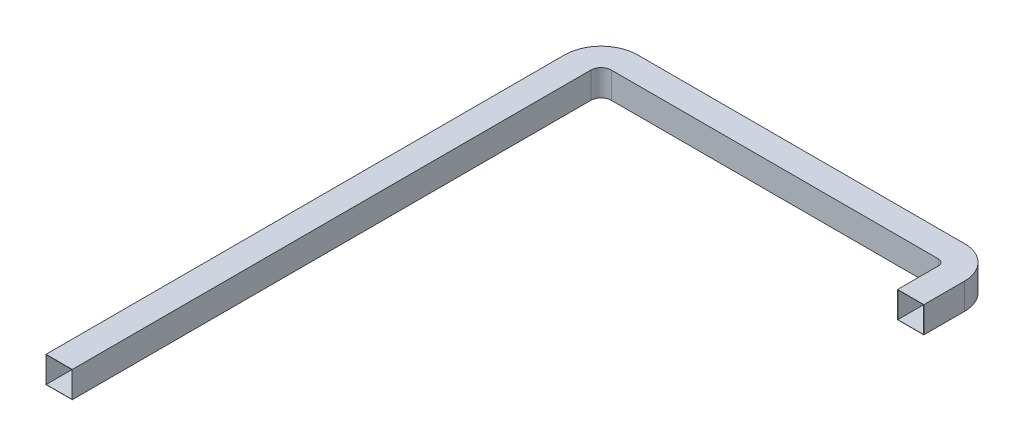
ISO-10303-21;
HEADER;
FILE_DESCRIPTION(('STEP AP214'),'2;1');
FILE_NAME('part.step','',(''),(''),'','','');
FILE_SCHEMA(('AUTOMOTIVE_DESIGN { 1 0 10303 214 1 1 1 1 }'));
ENDSEC;
DATA;
#1=APPLICATION_CONTEXT('core data for automotive mechanical design processes');
#2=APPLICATION_PROTOCOL_DEFINITION('international standard','automotive_design',2000,#1);
#3=PRODUCT_CONTEXT('',#1,'mechanical');
#4=PRODUCT('Part','Part','',(#3));
#5=PRODUCT_RELATED_PRODUCT_CATEGORY('part','',(#4));
#6=PRODUCT_DEFINITION_FORMATION('','',#4);
#7=PRODUCT_DEFINITION_CONTEXT('part definition',#1,'design');
#8=PRODUCT_DEFINITION('design','',#6,#7);
#9=PRODUCT_DEFINITION_SHAPE('','',#8);
#10=(LENGTH_UNIT() NAMED_UNIT(*) SI_UNIT(.MILLI.,.METRE.));
#11=(NAMED_UNIT(*) PLANE_ANGLE_UNIT() SI_UNIT($,.RADIAN.));
#12=(NAMED_UNIT(*) SI_UNIT($,.STERADIAN.) SOLID_ANGLE_UNIT());
#13=UNCERTAINTY_MEASURE_WITH_UNIT(LENGTH_MEASURE(1.E-05),#10,'distance_accuracy_value','');
#14=(GEOMETRIC_REPRESENTATION_CONTEXT(3) GLOBAL_UNCERTAINTY_ASSIGNED_CONTEXT((#13)) GLOBAL_UNIT_ASSIGNED_CONTEXT((#10,
#11,#12)) REPRESENTATION_CONTEXT('',''));
#15=CARTESIAN_POINT('',(0.,0.,0.));
#16=DIRECTION('',(0.,0.,1.));
#17=DIRECTION('',(1.,0.,0.));
#18=AXIS2_PLACEMENT_3D('',#15,#16,#17);
#19=CARTESIAN_POINT('',(0.,154.94,228.6));
#20=DIRECTION('',(0.,-1.,0.));
#21=DIRECTION('',(1.,0.,0.));
#22=AXIS2_PLACEMENT_3D('',#19,#20,#21);
#23=PLANE('',#22);
#24=DIRECTION('',(0.,0.,-1.));
#25=VECTOR('',#24,1.);
#26=CARTESIAN_POINT('',(154.94,154.94,228.6));
#27=LINE('',#26,#25);
#28=CARTESIAN_POINT('',(154.94,154.94,228.6));
#29=VERTEX_POINT('',#28);
#30=CARTESIAN_POINT('',(154.94,154.94,-254.));
#31=VERTEX_POINT('',#30);
#32=EDGE_CURVE('E514',#29,#31,#27,.T.);
#33=ORIENTED_EDGE('',*,*,#32,.T.);
#34=CARTESIAN_POINT('',(-226.06,154.94,-254.));
#35=DIRECTION('',(0.,1.,0.));
#36=DIRECTION('',(-1.,0.,0.));
#37=AXIS2_PLACEMENT_3D('',#34,#35,#36);
#38=CIRCLE('',#37,381.);
#39=CARTESIAN_POINT('',(-226.06,154.94,-635.));
#40=VERTEX_POINT('',#39);
#41=EDGE_CURVE('E437',#31,#40,#38,.T.);
#42=ORIENTED_EDGE('',*,*,#41,.T.);
#43=DIRECTION('',(-1.,0.,0.));
#44=VECTOR('',#43,1.);
#45=CARTESIAN_POINT('',(-226.06,154.94,-635.));
#46=LINE('',#45,#44);
#47=CARTESIAN_POINT('',(-4086.86,154.94,-634.999999999999));
#48=VERTEX_POINT('',#47);
#49=EDGE_CURVE('E460',#40,#48,#46,.T.);
#50=ORIENTED_EDGE('',*,*,#49,.T.);
#51=CARTESIAN_POINT('',(-4086.86,154.94,-203.199999999999));
#52=DIRECTION('',(0.,-1.,0.));
#53=DIRECTION('',(1.,0.,0.));
#54=AXIS2_PLACEMENT_3D('',#51,#52,#53);
#55=CIRCLE('',#54,431.8);
#56=CARTESIAN_POINT('',(-4518.66,154.94,-203.199999999999));
#57=VERTEX_POINT('',#56);
#58=EDGE_CURVE('E355',#48,#57,#55,.F.);
#59=ORIENTED_EDGE('',*,*,#58,.T.);
#60=DIRECTION('',(0.,0.,1.));
#61=VECTOR('',#60,1.);
#62=CARTESIAN_POINT('',(-4518.66,154.94,-203.199999999999));
#63=LINE('',#62,#61);
#64=CARTESIAN_POINT('',(-4518.66,154.94,5918.2));
#65=VERTEX_POINT('',#64);
#66=EDGE_CURVE('E352',#57,#65,#63,.T.);
#67=ORIENTED_EDGE('',*,*,#66,.T.);
#68=DIRECTION('',(-1.,0.,0.));
#69=VECTOR('',#68,1.);
#70=CARTESIAN_POINT('',(-4208.78,154.94,5918.2));
#71=LINE('',#70,#69);
#72=CARTESIAN_POINT('',(-4208.78,154.94,5918.2));
#73=VERTEX_POINT('',#72);
#74=EDGE_CURVE('E270',#73,#65,#71,.T.);
#75=ORIENTED_EDGE('',*,*,#74,.F.);
#76=DIRECTION('',(0.,0.,-1.));
#77=VECTOR('',#76,1.);
#78=CARTESIAN_POINT('',(-4208.78,154.94,-177.799999999999));
#79=LINE('',#78,#77);
#80=CARTESIAN_POINT('',(-4208.78,154.94,-203.199999999999));
#81=VERTEX_POINT('',#80);
#82=EDGE_CURVE('E348',#73,#81,#79,.T.);
#83=ORIENTED_EDGE('',*,*,#82,.T.);
#84=CARTESIAN_POINT('',(-4086.86,154.94,-203.199999999999));
#85=DIRECTION('',(0.,-1.,0.));
#86=DIRECTION('',(1.,0.,0.));
#87=AXIS2_PLACEMENT_3D('',#84,#85,#86);
#88=CIRCLE('',#87,121.92);
#89=CARTESIAN_POINT('',(-4086.86,154.94,-325.12));
#90=VERTEX_POINT('',#89);
#91=EDGE_CURVE('E344',#81,#90,#88,.T.);
#92=ORIENTED_EDGE('',*,*,#91,.T.);
#93=DIRECTION('',(1.,0.,0.));
#94=VECTOR('',#93,1.);
#95=CARTESIAN_POINT('',(-226.06,154.94,-325.12));
#96=LINE('',#95,#94);
#97=CARTESIAN_POINT('',(-226.06,154.94,-325.12));
#98=VERTEX_POINT('',#97);
#99=EDGE_CURVE('E463',#90,#98,#96,.T.);
#100=ORIENTED_EDGE('',*,*,#99,.T.);
#101=CARTESIAN_POINT('',(-226.06,154.94,-254.));
#102=DIRECTION('',(0.,-1.,0.));
#103=DIRECTION('',(-1.,0.,0.));
#104=AXIS2_PLACEMENT_3D('',#101,#102,#103);
#105=CIRCLE('',#104,71.1199999999999);
#106=CARTESIAN_POINT('',(-154.94,154.94,-254.));
#107=VERTEX_POINT('',#106);
#108=EDGE_CURVE('E467',#98,#107,#105,.T.);
#109=ORIENTED_EDGE('',*,*,#108,.T.);
#110=DIRECTION('',(0.,0.,-1.));
#111=VECTOR('',#110,1.);
#112=CARTESIAN_POINT('',(-154.94,154.94,228.6));
#113=LINE('',#112,#111);
#114=CARTESIAN_POINT('',(-154.94,154.94,228.6));
#115=VERTEX_POINT('',#114);
#116=EDGE_CURVE('E11',#115,#107,#113,.T.);
#117=ORIENTED_EDGE('',*,*,#116,.F.);
#118=DIRECTION('',(-1.,0.,0.));
#119=VECTOR('',#118,1.);
#120=CARTESIAN_POINT('',(0.,154.94,228.6));
#121=LINE('',#120,#119);
#122=EDGE_CURVE('E503',#29,#115,#121,.T.);
#123=ORIENTED_EDGE('',*,*,#122,.F.);
#124=EDGE_LOOP('',(#33,#42,#50,#59,#67,#75,#83,#92,#100,#109,#117,#123));
#125=FACE_BOUND('',#124,.T.);
#126=ADVANCED_FACE('F43',(#125),#23,.F.);
#127=CARTESIAN_POINT('',(-154.94,0.,228.6));
#128=DIRECTION('',(1.,0.,0.));
#129=DIRECTION('',(0.,1.,0.));
#130=AXIS2_PLACEMENT_3D('',#127,#128,#129);
#131=PLANE('',#130);
#132=ORIENTED_EDGE('',*,*,#116,.T.);
#133=DIRECTION('',(0.,1.,0.));
#134=VECTOR('',#133,1.);
#135=CARTESIAN_POINT('',(-154.94,-729.676391748426,-254.));
#136=LINE('',#135,#134);
#137=CARTESIAN_POINT('',(-154.94,-154.94,-254.));
#138=VERTEX_POINT('',#137);
#139=EDGE_CURVE('E450',#138,#107,#136,.T.);
#140=ORIENTED_EDGE('',*,*,#139,.F.);
#141=DIRECTION('',(0.,0.,-1.));
#142=VECTOR('',#141,1.);
#143=CARTESIAN_POINT('',(-154.94,-154.94,228.6));
#144=LINE('',#143,#142);
#145=CARTESIAN_POINT('',(-154.94,-154.94,228.6));
#146=VERTEX_POINT('',#145);
#147=EDGE_CURVE('E53',#146,#138,#144,.T.);
#148=ORIENTED_EDGE('',*,*,#147,.F.);
#149=DIRECTION('',(0.,-1.,0.));
#150=VECTOR('',#149,1.);
#151=CARTESIAN_POINT('',(-154.94,0.,228.6));
#152=LINE('',#151,#150);
#153=EDGE_CURVE('E506',#115,#146,#152,.T.);
#154=ORIENTED_EDGE('',*,*,#153,.F.);
#155=EDGE_LOOP('',(#132,#140,#148,#154));
#156=FACE_BOUND('',#155,.T.);
#157=ADVANCED_FACE('F575',(#156),#131,.F.);
#158=CARTESIAN_POINT('',(0.,-154.94,228.6));
#159=DIRECTION('',(0.,1.,0.));
#160=DIRECTION('',(0.,0.,1.));
#161=AXIS2_PLACEMENT_3D('',#158,#159,#160);
#162=PLANE('',#161);
#163=ORIENTED_EDGE('',*,*,#147,.T.);
#164=CARTESIAN_POINT('',(-226.06,-154.94,-254.));
#165=DIRECTION('',(0.,1.,0.));
#166=DIRECTION('',(0.,0.,1.));
#167=AXIS2_PLACEMENT_3D('',#164,#165,#166);
#168=CIRCLE('',#167,71.1199999999999);
#169=CARTESIAN_POINT('',(-226.06,-154.94,-325.12));
#170=VERTEX_POINT('',#169);
#171=EDGE_CURVE('E453',#138,#170,#168,.T.);
#172=ORIENTED_EDGE('',*,*,#171,.T.);
#173=DIRECTION('',(-1.,0.,0.));
#174=VECTOR('',#173,1.);
#175=CARTESIAN_POINT('',(-226.06,-154.94,-325.12));
#176=LINE('',#175,#174);
#177=CARTESIAN_POINT('',(-4086.86,-154.94,-325.12));
#178=VERTEX_POINT('',#177);
#179=EDGE_CURVE('E449',#170,#178,#176,.T.);
#180=ORIENTED_EDGE('',*,*,#179,.T.);
#181=CARTESIAN_POINT('',(-4086.86,-154.94,-203.199999999999));
#182=DIRECTION('',(0.,1.,0.));
#183=DIRECTION('',(0.,0.,-1.));
#184=AXIS2_PLACEMENT_3D('',#181,#182,#183);
#185=CIRCLE('',#184,121.92);
#186=CARTESIAN_POINT('',(-4208.78,-154.94,-203.199999999999));
#187=VERTEX_POINT('',#186);
#188=EDGE_CURVE('E343',#178,#187,#185,.T.);
#189=ORIENTED_EDGE('',*,*,#188,.T.);
#190=DIRECTION('',(0.,0.,1.));
#191=VECTOR('',#190,1.);
#192=CARTESIAN_POINT('',(-4208.78,-154.94,-177.799999999999));
#193=LINE('',#192,#191);
#194=CARTESIAN_POINT('',(-4208.78,-154.94,5918.2));
#195=VERTEX_POINT('',#194);
#196=EDGE_CURVE('E362',#187,#195,#193,.T.);
#197=ORIENTED_EDGE('',*,*,#196,.T.);
#198=DIRECTION('',(1.,0.,0.));
#199=VECTOR('',#198,1.);
#200=CARTESIAN_POINT('',(-4518.66,-154.94,5918.2));
#201=LINE('',#200,#199);
#202=CARTESIAN_POINT('',(-4518.66,-154.94,5918.2));
#203=VERTEX_POINT('',#202);
#204=EDGE_CURVE('E278',#203,#195,#201,.T.);
#205=ORIENTED_EDGE('',*,*,#204,.F.);
#206=DIRECTION('',(0.,0.,-1.));
#207=VECTOR('',#206,1.);
#208=CARTESIAN_POINT('',(-4518.66,-154.94,-203.199999999999));
#209=LINE('',#208,#207);
#210=CARTESIAN_POINT('',(-4518.66,-154.94,-203.199999999999));
#211=VERTEX_POINT('',#210);
#212=EDGE_CURVE('E365',#203,#211,#209,.T.);
#213=ORIENTED_EDGE('',*,*,#212,.T.);
#214=CARTESIAN_POINT('',(-4086.86,-154.94,-203.199999999999));
#215=DIRECTION('',(0.,-1.,0.));
#216=DIRECTION('',(0.,0.,1.));
#217=AXIS2_PLACEMENT_3D('',#214,#215,#216);
#218=CIRCLE('',#217,431.8);
#219=CARTESIAN_POINT('',(-4086.86,-154.94,-634.999999999999));
#220=VERTEX_POINT('',#219);
#221=EDGE_CURVE('E369',#211,#220,#218,.T.);
#222=ORIENTED_EDGE('',*,*,#221,.T.);
#223=DIRECTION('',(1.,0.,0.));
#224=VECTOR('',#223,1.);
#225=CARTESIAN_POINT('',(-226.06,-154.94,-635.));
#226=LINE('',#225,#224);
#227=CARTESIAN_POINT('',(-226.06,-154.94,-635.));
#228=VERTEX_POINT('',#227);
#229=EDGE_CURVE('E446',#220,#228,#226,.T.);
#230=ORIENTED_EDGE('',*,*,#229,.T.);
#231=CARTESIAN_POINT('',(-226.06,-154.94,-254.));
#232=DIRECTION('',(0.,1.,0.));
#233=DIRECTION('',(0.,0.,1.));
#234=AXIS2_PLACEMENT_3D('',#231,#232,#233);
#235=CIRCLE('',#234,381.);
#236=CARTESIAN_POINT('',(154.94,-154.94,-254.));
#237=VERTEX_POINT('',#236);
#238=EDGE_CURVE('E456',#228,#237,#235,.F.);
#239=ORIENTED_EDGE('',*,*,#238,.T.);
#240=DIRECTION('',(0.,0.,-1.));
#241=VECTOR('',#240,1.);
#242=CARTESIAN_POINT('',(154.94,-154.94,228.6));
#243=LINE('',#242,#241);
#244=CARTESIAN_POINT('',(154.94,-154.94,228.6));
#245=VERTEX_POINT('',#244);
#246=EDGE_CURVE('E517',#245,#237,#243,.T.);
#247=ORIENTED_EDGE('',*,*,#246,.F.);
#248=DIRECTION('',(1.,0.,0.));
#249=VECTOR('',#248,1.);
#250=CARTESIAN_POINT('',(0.,-154.94,228.6));
#251=LINE('',#250,#249);
#252=EDGE_CURVE('E66',#146,#245,#251,.T.);
#253=ORIENTED_EDGE('',*,*,#252,.F.);
#254=EDGE_LOOP('',(#163,#172,#180,#189,#197,#205,#213,#222,#230,#239,#247,#253));
#255=FACE_BOUND('',#254,.T.);
#256=ADVANCED_FACE('F581',(#255),#162,.F.);
#257=CARTESIAN_POINT('',(-152.4,0.,228.6));
#258=DIRECTION('',(1.,0.,0.));
#259=DIRECTION('',(0.,0.,-1.));
#260=AXIS2_PLACEMENT_3D('',#257,#258,#259);
#261=PLANE('',#260);
#262=DIRECTION('',(0.,0.,-1.));
#263=VECTOR('',#262,1.);
#264=CARTESIAN_POINT('',(-152.4,-152.4,228.6));
#265=LINE('',#264,#263);
#266=CARTESIAN_POINT('',(-152.4,-152.4,228.6));
#267=VERTEX_POINT('',#266);
#268=CARTESIAN_POINT('',(-152.4,-152.4,-254.));
#269=VERTEX_POINT('',#268);
#270=EDGE_CURVE('E513',#267,#269,#265,.T.);
#271=ORIENTED_EDGE('',*,*,#270,.T.);
#272=DIRECTION('',(0.,1.,0.));
#273=VECTOR('',#272,1.);
#274=CARTESIAN_POINT('',(-152.4,-729.676391748426,-254.));
#275=LINE('',#274,#273);
#276=CARTESIAN_POINT('',(-152.4,152.4,-254.));
#277=VERTEX_POINT('',#276);
#278=EDGE_CURVE('E418',#269,#277,#275,.T.);
#279=ORIENTED_EDGE('',*,*,#278,.T.);
#280=DIRECTION('',(0.,0.,-1.));
#281=VECTOR('',#280,1.);
#282=CARTESIAN_POINT('',(-152.4,152.4,228.6));
#283=LINE('',#282,#281);
#284=CARTESIAN_POINT('',(-152.4,152.4,228.6));
#285=VERTEX_POINT('',#284);
#286=EDGE_CURVE('E47',#285,#277,#283,.T.);
#287=ORIENTED_EDGE('',*,*,#286,.F.);
#288=DIRECTION('',(0.,-1.,0.));
#289=VECTOR('',#288,1.);
#290=CARTESIAN_POINT('',(-152.4,0.,228.6));
#291=LINE('',#290,#289);
#292=EDGE_CURVE('E487',#285,#267,#291,.T.);
#293=ORIENTED_EDGE('',*,*,#292,.T.);
#294=EDGE_LOOP('',(#271,#279,#287,#293));
#295=FACE_BOUND('',#294,.T.);
#296=ADVANCED_FACE('F45',(#295),#261,.T.);
#297=CARTESIAN_POINT('',(0.,152.4,228.6));
#298=DIRECTION('',(0.,-1.,0.));
#299=DIRECTION('',(0.,0.,-1.));
#300=AXIS2_PLACEMENT_3D('',#297,#298,#299);
#301=PLANE('',#300);
#302=ORIENTED_EDGE('',*,*,#286,.T.);
#303=CARTESIAN_POINT('',(-226.06,152.4,-254.));
#304=DIRECTION('',(0.,-1.,0.));
#305=DIRECTION('',(1.,0.,0.));
#306=AXIS2_PLACEMENT_3D('',#303,#304,#305);
#307=CIRCLE('',#306,73.6599999999999);
#308=CARTESIAN_POINT('',(-226.06,152.4,-327.66));
#309=VERTEX_POINT('',#308);
#310=EDGE_CURVE('E413',#309,#277,#307,.T.);
#311=ORIENTED_EDGE('',*,*,#310,.F.);
#312=DIRECTION('',(1.,0.,0.));
#313=VECTOR('',#312,1.);
#314=CARTESIAN_POINT('',(-226.06,152.4,-327.66));
#315=LINE('',#314,#313);
#316=CARTESIAN_POINT('',(-4061.46,152.4,-327.659999999999));
#317=VERTEX_POINT('',#316);
#318=EDGE_CURVE('E409',#317,#309,#315,.T.);
#319=ORIENTED_EDGE('',*,*,#318,.F.);
#320=DIRECTION('',(0.,0.,-1.));
#321=VECTOR('',#320,1.);
#322=CARTESIAN_POINT('',(-4061.46,152.4,-632.459999999999));
#323=LINE('',#322,#321);
#324=CARTESIAN_POINT('',(-4061.46,152.4,-632.459999999999));
#325=VERTEX_POINT('',#324);
#326=EDGE_CURVE('E389',#317,#325,#323,.T.);
#327=ORIENTED_EDGE('',*,*,#326,.T.);
#328=DIRECTION('',(-1.,0.,0.));
#329=VECTOR('',#328,1.);
#330=CARTESIAN_POINT('',(-226.06,152.4,-632.46));
#331=LINE('',#330,#329);
#332=CARTESIAN_POINT('',(-226.06,152.4,-632.46));
#333=VERTEX_POINT('',#332);
#334=EDGE_CURVE('E405',#333,#325,#331,.T.);
#335=ORIENTED_EDGE('',*,*,#334,.F.);
#336=CARTESIAN_POINT('',(-226.06,152.4,-254.));
#337=DIRECTION('',(0.,-1.,0.));
#338=DIRECTION('',(1.,0.,0.));
#339=AXIS2_PLACEMENT_3D('',#336,#337,#338);
#340=CIRCLE('',#339,378.46);
#341=CARTESIAN_POINT('',(152.4,152.4,-254.));
#342=VERTEX_POINT('',#341);
#343=EDGE_CURVE('E401',#342,#333,#340,.F.);
#344=ORIENTED_EDGE('',*,*,#343,.F.);
#345=DIRECTION('',(0.,0.,-1.));
#346=VECTOR('',#345,1.);
#347=CARTESIAN_POINT('',(152.4,152.4,228.6));
#348=LINE('',#347,#346);
#349=CARTESIAN_POINT('',(152.4,152.4,228.6));
#350=VERTEX_POINT('',#349);
#351=EDGE_CURVE('E526',#350,#342,#348,.T.);
#352=ORIENTED_EDGE('',*,*,#351,.F.);
#353=DIRECTION('',(-1.,0.,0.));
#354=VECTOR('',#353,1.);
#355=CARTESIAN_POINT('',(0.,152.4,228.6));
#356=LINE('',#355,#354);
#357=EDGE_CURVE('E491',#350,#285,#356,.T.);
#358=ORIENTED_EDGE('',*,*,#357,.T.);
#359=EDGE_LOOP('',(#302,#311,#319,#327,#335,#344,#352,#358));
#360=FACE_BOUND('',#359,.T.);
#361=ADVANCED_FACE('F533',(#360),#301,.T.);
#362=CARTESIAN_POINT('',(152.4,0.,228.6));
#363=DIRECTION('',(-1.,0.,0.));
#364=DIRECTION('',(0.,0.,1.));
#365=AXIS2_PLACEMENT_3D('',#362,#363,#364);
#366=PLANE('',#365);
#367=ORIENTED_EDGE('',*,*,#351,.T.);
#368=DIRECTION('',(0.,1.,0.));
#369=VECTOR('',#368,1.);
#370=CARTESIAN_POINT('',(152.4,0.,-254.));
#371=LINE('',#370,#369);
#372=CARTESIAN_POINT('',(152.4,-152.4,-254.));
#373=VERTEX_POINT('',#372);
#374=EDGE_CURVE('E417',#373,#342,#371,.T.);
#375=ORIENTED_EDGE('',*,*,#374,.F.);
#376=DIRECTION('',(0.,0.,-1.));
#377=VECTOR('',#376,1.);
#378=CARTESIAN_POINT('',(152.4,-152.4,228.6));
#379=LINE('',#378,#377);
#380=CARTESIAN_POINT('',(152.4,-152.4,228.6));
#381=VERTEX_POINT('',#380);
#382=EDGE_CURVE('E524',#381,#373,#379,.T.);
#383=ORIENTED_EDGE('',*,*,#382,.F.);
#384=DIRECTION('',(0.,1.,0.));
#385=VECTOR('',#384,1.);
#386=CARTESIAN_POINT('',(152.4,0.,228.6));
#387=LINE('',#386,#385);
#388=EDGE_CURVE('E495',#381,#350,#387,.T.);
#389=ORIENTED_EDGE('',*,*,#388,.T.);
#390=EDGE_LOOP('',(#367,#375,#383,#389));
#391=FACE_BOUND('',#390,.T.);
#392=ADVANCED_FACE('F561',(#391),#366,.T.);
#393=CARTESIAN_POINT('',(0.,-152.4,228.6));
#394=DIRECTION('',(0.,1.,0.));
#395=DIRECTION('',(0.,0.,1.));
#396=AXIS2_PLACEMENT_3D('',#393,#394,#395);
#397=PLANE('',#396);
#398=ORIENTED_EDGE('',*,*,#382,.T.);
#399=CARTESIAN_POINT('',(-226.06,-152.4,-254.));
#400=DIRECTION('',(0.,1.,0.));
#401=DIRECTION('',(0.,0.,1.));
#402=AXIS2_PLACEMENT_3D('',#399,#400,#401);
#403=CIRCLE('',#402,378.46);
#404=CARTESIAN_POINT('',(-226.06,-152.4,-632.46));
#405=VERTEX_POINT('',#404);
#406=EDGE_CURVE('E427',#405,#373,#403,.F.);
#407=ORIENTED_EDGE('',*,*,#406,.F.);
#408=DIRECTION('',(1.,0.,0.));
#409=VECTOR('',#408,1.);
#410=CARTESIAN_POINT('',(-226.06,-152.4,-632.46));
#411=LINE('',#410,#409);
#412=CARTESIAN_POINT('',(-4061.46,-152.4,-632.46));
#413=VERTEX_POINT('',#412);
#414=EDGE_CURVE('E422',#413,#405,#411,.T.);
#415=ORIENTED_EDGE('',*,*,#414,.F.);
#416=DIRECTION('',(0.,0.,1.));
#417=VECTOR('',#416,1.);
#418=CARTESIAN_POINT('',(-4061.46,-152.4,-327.659999999999));
#419=LINE('',#418,#417);
#420=CARTESIAN_POINT('',(-4061.46,-152.4,-327.659999999999));
#421=VERTEX_POINT('',#420);
#422=EDGE_CURVE('E397',#413,#421,#419,.T.);
#423=ORIENTED_EDGE('',*,*,#422,.T.);
#424=DIRECTION('',(-1.,0.,0.));
#425=VECTOR('',#424,1.);
#426=CARTESIAN_POINT('',(-226.06,-152.4,-327.66));
#427=LINE('',#426,#425);
#428=CARTESIAN_POINT('',(-226.06,-152.4,-327.66));
#429=VERTEX_POINT('',#428);
#430=EDGE_CURVE('E428',#429,#421,#427,.T.);
#431=ORIENTED_EDGE('',*,*,#430,.F.);
#432=CARTESIAN_POINT('',(-226.06,-152.4,-254.));
#433=DIRECTION('',(0.,1.,0.));
#434=DIRECTION('',(0.,0.,1.));
#435=AXIS2_PLACEMENT_3D('',#432,#433,#434);
#436=CIRCLE('',#435,73.6599999999999);
#437=EDGE_CURVE('E424',#269,#429,#436,.T.);
#438=ORIENTED_EDGE('',*,*,#437,.F.);
#439=ORIENTED_EDGE('',*,*,#270,.F.);
#440=DIRECTION('',(1.,0.,0.));
#441=VECTOR('',#440,1.);
#442=CARTESIAN_POINT('',(0.,-152.4,228.6));
#443=LINE('',#442,#441);
#444=EDGE_CURVE('E499',#267,#381,#443,.T.);
#445=ORIENTED_EDGE('',*,*,#444,.T.);
#446=EDGE_LOOP('',(#398,#407,#415,#423,#431,#438,#439,#445));
#447=FACE_BOUND('',#446,.T.);
#448=ADVANCED_FACE('F558',(#447),#397,.T.);
#449=CARTESIAN_POINT('',(154.94,0.,228.6));
#450=DIRECTION('',(-1.,0.,0.));
#451=DIRECTION('',(0.,0.,1.));
#452=AXIS2_PLACEMENT_3D('',#449,#450,#451);
#453=PLANE('',#452);
#454=ORIENTED_EDGE('',*,*,#246,.T.);
#455=DIRECTION('',(0.,1.,0.));
#456=VECTOR('',#455,1.);
#457=CARTESIAN_POINT('',(154.94,-729.676391748426,-254.));
#458=LINE('',#457,#456);
#459=EDGE_CURVE('E471',#237,#31,#458,.T.);
#460=ORIENTED_EDGE('',*,*,#459,.T.);
#461=ORIENTED_EDGE('',*,*,#32,.F.);
#462=DIRECTION('',(0.,1.,0.));
#463=VECTOR('',#462,1.);
#464=CARTESIAN_POINT('',(154.94,0.,228.6));
#465=LINE('',#464,#463);
#466=EDGE_CURVE('E61',#245,#29,#465,.T.);
#467=ORIENTED_EDGE('',*,*,#466,.F.);
#468=EDGE_LOOP('',(#454,#460,#461,#467));
#469=FACE_BOUND('',#468,.T.);
#470=ADVANCED_FACE('F566',(#469),#453,.F.);
#471=CARTESIAN_POINT('',(0.,0.,228.6));
#472=DIRECTION('',(0.,0.,1.));
#473=DIRECTION('',(1.,0.,0.));
#474=AXIS2_PLACEMENT_3D('',#471,#472,#473);
#475=PLANE('',#474);
#476=ORIENTED_EDGE('',*,*,#292,.F.);
#477=ORIENTED_EDGE('',*,*,#357,.F.);
#478=ORIENTED_EDGE('',*,*,#388,.F.);
#479=ORIENTED_EDGE('',*,*,#444,.F.);
#480=EDGE_LOOP('',(#476,#477,#478,#479));
#481=FACE_BOUND('',#480,.T.);
#482=ORIENTED_EDGE('',*,*,#122,.T.);
#483=ORIENTED_EDGE('',*,*,#153,.T.);
#484=ORIENTED_EDGE('',*,*,#252,.T.);
#485=ORIENTED_EDGE('',*,*,#466,.T.);
#486=EDGE_LOOP('',(#482,#483,#484,#485));
#487=FACE_BOUND('',#486,.T.);
#488=ADVANCED_FACE('F563',(#481,#487),#475,.T.);
#489=CARTESIAN_POINT('',(-226.06,-729.676391748426,-254.));
#490=DIRECTION('',(0.,1.,0.));
#491=DIRECTION('',(-1.,0.,0.));
#492=AXIS2_PLACEMENT_3D('',#489,#490,#491);
#493=CYLINDRICAL_SURFACE('',#492,71.1199999999999);
#494=ORIENTED_EDGE('',*,*,#171,.F.);
#495=ORIENTED_EDGE('',*,*,#139,.T.);
#496=ORIENTED_EDGE('',*,*,#108,.F.);
#497=DIRECTION('',(0.,1.,0.));
#498=VECTOR('',#497,1.);
#499=CARTESIAN_POINT('',(-226.06,-729.676391748426,-325.12));
#500=LINE('',#499,#498);
#501=EDGE_CURVE('E475',#170,#98,#500,.T.);
#502=ORIENTED_EDGE('',*,*,#501,.F.);
#503=EDGE_LOOP('',(#494,#495,#496,#502));
#504=FACE_BOUND('',#503,.T.);
#505=ADVANCED_FACE('F565',(#504),#493,.F.);
#506=CARTESIAN_POINT('',(-226.06,-729.676391748426,-325.12));
#507=DIRECTION('',(0.,0.,1.));
#508=DIRECTION('',(1.,0.,0.));
#509=AXIS2_PLACEMENT_3D('',#506,#507,#508);
#510=PLANE('',#509);
#511=ORIENTED_EDGE('',*,*,#179,.F.);
#512=ORIENTED_EDGE('',*,*,#501,.T.);
#513=ORIENTED_EDGE('',*,*,#99,.F.);
#514=DIRECTION('',(0.,-1.,0.));
#515=VECTOR('',#514,1.);
#516=CARTESIAN_POINT('',(-4086.86,801.518440716979,-325.12));
#517=LINE('',#516,#515);
#518=EDGE_CURVE('E373',#90,#178,#517,.T.);
#519=ORIENTED_EDGE('',*,*,#518,.T.);
#520=EDGE_LOOP('',(#511,#512,#513,#519));
#521=FACE_BOUND('',#520,.T.);
#522=ADVANCED_FACE('F583',(#521),#510,.T.);
#523=CARTESIAN_POINT('',(-226.06,-729.676391748426,-635.));
#524=DIRECTION('',(0.,0.,-1.));
#525=DIRECTION('',(-1.,0.,0.));
#526=AXIS2_PLACEMENT_3D('',#523,#524,#525);
#527=PLANE('',#526);
#528=ORIENTED_EDGE('',*,*,#229,.F.);
#529=DIRECTION('',(0.,-1.,0.));
#530=VECTOR('',#529,1.);
#531=CARTESIAN_POINT('',(-4086.86,801.518440716979,-634.999999999999));
#532=LINE('',#531,#530);
#533=EDGE_CURVE('E349',#48,#220,#532,.T.);
#534=ORIENTED_EDGE('',*,*,#533,.F.);
#535=ORIENTED_EDGE('',*,*,#49,.F.);
#536=DIRECTION('',(0.,1.,0.));
#537=VECTOR('',#536,1.);
#538=CARTESIAN_POINT('',(-226.06,-729.676391748426,-635.));
#539=LINE('',#538,#537);
#540=EDGE_CURVE('E478',#228,#40,#539,.T.);
#541=ORIENTED_EDGE('',*,*,#540,.F.);
#542=EDGE_LOOP('',(#528,#534,#535,#541));
#543=FACE_BOUND('',#542,.T.);
#544=ADVANCED_FACE('F610',(#543),#527,.T.);
#545=CARTESIAN_POINT('',(-226.06,-729.676391748426,-254.));
#546=DIRECTION('',(0.,1.,0.));
#547=DIRECTION('',(-1.,0.,0.));
#548=AXIS2_PLACEMENT_3D('',#545,#546,#547);
#549=CYLINDRICAL_SURFACE('',#548,381.);
#550=ORIENTED_EDGE('',*,*,#238,.F.);
#551=ORIENTED_EDGE('',*,*,#540,.T.);
#552=ORIENTED_EDGE('',*,*,#41,.F.);
#553=ORIENTED_EDGE('',*,*,#459,.F.);
#554=EDGE_LOOP('',(#550,#551,#552,#553));
#555=FACE_BOUND('',#554,.T.);
#556=ADVANCED_FACE('F615',(#555),#549,.T.);
#557=CARTESIAN_POINT('',(-226.06,-729.676391748426,-254.));
#558=DIRECTION('',(0.,1.,0.));
#559=DIRECTION('',(-1.,0.,0.));
#560=AXIS2_PLACEMENT_3D('',#557,#558,#559);
#561=CYLINDRICAL_SURFACE('',#560,73.6599999999999);
#562=ORIENTED_EDGE('',*,*,#437,.T.);
#563=DIRECTION('',(0.,1.,0.));
#564=VECTOR('',#563,1.);
#565=CARTESIAN_POINT('',(-226.06,-729.676391748426,-327.66));
#566=LINE('',#565,#564);
#567=EDGE_CURVE('E423',#429,#309,#566,.T.);
#568=ORIENTED_EDGE('',*,*,#567,.T.);
#569=ORIENTED_EDGE('',*,*,#310,.T.);
#570=ORIENTED_EDGE('',*,*,#278,.F.);
#571=EDGE_LOOP('',(#562,#568,#569,#570));
#572=FACE_BOUND('',#571,.T.);
#573=ADVANCED_FACE('F541',(#572),#561,.T.);
#574=CARTESIAN_POINT('',(-226.06,-729.676391748426,-327.66));
#575=DIRECTION('',(0.,0.,1.));
#576=DIRECTION('',(1.,0.,0.));
#577=AXIS2_PLACEMENT_3D('',#574,#575,#576);
#578=PLANE('',#577);
#579=ORIENTED_EDGE('',*,*,#430,.T.);
#580=DIRECTION('',(0.,1.,0.));
#581=VECTOR('',#580,1.);
#582=CARTESIAN_POINT('',(-4061.46,-152.4,-327.659999999999));
#583=LINE('',#582,#581);
#584=EDGE_CURVE('E358',#421,#317,#583,.T.);
#585=ORIENTED_EDGE('',*,*,#584,.T.);
#586=ORIENTED_EDGE('',*,*,#318,.T.);
#587=ORIENTED_EDGE('',*,*,#567,.F.);
#588=EDGE_LOOP('',(#579,#585,#586,#587));
#589=FACE_BOUND('',#588,.T.);
#590=ADVANCED_FACE('F545',(#589),#578,.F.);
#591=CARTESIAN_POINT('',(-226.06,-729.676391748426,-632.46));
#592=DIRECTION('',(0.,0.,-1.));
#593=DIRECTION('',(-1.,0.,0.));
#594=AXIS2_PLACEMENT_3D('',#591,#592,#593);
#595=PLANE('',#594);
#596=ORIENTED_EDGE('',*,*,#414,.T.);
#597=DIRECTION('',(0.,1.,0.));
#598=VECTOR('',#597,1.);
#599=CARTESIAN_POINT('',(-226.06,-729.676391748426,-632.46));
#600=LINE('',#599,#598);
#601=EDGE_CURVE('E441',#405,#333,#600,.T.);
#602=ORIENTED_EDGE('',*,*,#601,.T.);
#603=ORIENTED_EDGE('',*,*,#334,.T.);
#604=DIRECTION('',(0.,-1.,0.));
#605=VECTOR('',#604,1.);
#606=CARTESIAN_POINT('',(-4061.46,-152.4,-632.459999999999));
#607=LINE('',#606,#605);
#608=EDGE_CURVE('E393',#325,#413,#607,.T.);
#609=ORIENTED_EDGE('',*,*,#608,.T.);
#610=EDGE_LOOP('',(#596,#602,#603,#609));
#611=FACE_BOUND('',#610,.T.);
#612=ADVANCED_FACE('F552',(#611),#595,.F.);
#613=CARTESIAN_POINT('',(-226.06,-729.676391748426,-254.));
#614=DIRECTION('',(0.,1.,0.));
#615=DIRECTION('',(-1.,0.,0.));
#616=AXIS2_PLACEMENT_3D('',#613,#614,#615);
#617=CYLINDRICAL_SURFACE('',#616,378.46);
#618=ORIENTED_EDGE('',*,*,#406,.T.);
#619=ORIENTED_EDGE('',*,*,#374,.T.);
#620=ORIENTED_EDGE('',*,*,#343,.T.);
#621=ORIENTED_EDGE('',*,*,#601,.F.);
#622=EDGE_LOOP('',(#618,#619,#620,#621));
#623=FACE_BOUND('',#622,.T.);
#624=ADVANCED_FACE('F556',(#623),#617,.F.);
#625=CARTESIAN_POINT('',(-4061.46,801.518440716979,-325.119999999999));
#626=DIRECTION('',(1.,0.,0.));
#627=DIRECTION('',(0.,0.,-1.));
#628=AXIS2_PLACEMENT_3D('',#625,#626,#627);
#629=PLANE('',#628);
#630=ORIENTED_EDGE('',*,*,#326,.F.);
#631=ORIENTED_EDGE('',*,*,#584,.F.);
#632=ORIENTED_EDGE('',*,*,#422,.F.);
#633=ORIENTED_EDGE('',*,*,#608,.F.);
#634=EDGE_LOOP('',(#630,#631,#632,#633));
#635=FACE_BOUND('',#634,.T.);
#636=ADVANCED_FACE('F549',(#635),#629,.T.);
#637=CARTESIAN_POINT('',(-4086.86,801.518440716979,-203.199999999999));
#638=DIRECTION('',(0.,-1.,0.));
#639=DIRECTION('',(0.,0.,-1.));
#640=AXIS2_PLACEMENT_3D('',#637,#638,#639);
#641=CYLINDRICAL_SURFACE('',#640,431.8);
#642=ORIENTED_EDGE('',*,*,#58,.F.);
#643=ORIENTED_EDGE('',*,*,#533,.T.);
#644=ORIENTED_EDGE('',*,*,#221,.F.);
#645=DIRECTION('',(0.,-1.,0.));
#646=VECTOR('',#645,1.);
#647=CARTESIAN_POINT('',(-4518.66,801.518440716979,-203.199999999999));
#648=LINE('',#647,#646);
#649=EDGE_CURVE('E377',#57,#211,#648,.T.);
#650=ORIENTED_EDGE('',*,*,#649,.F.);
#651=EDGE_LOOP('',(#642,#643,#644,#650));
#652=FACE_BOUND('',#651,.T.);
#653=ADVANCED_FACE('F606',(#652),#641,.T.);
#654=CARTESIAN_POINT('',(-4518.66,801.518440716979,-203.199999999999));
#655=DIRECTION('',(-1.,0.,0.));
#656=DIRECTION('',(0.,0.,1.));
#657=AXIS2_PLACEMENT_3D('',#654,#655,#656);
#658=PLANE('',#657);
#659=ORIENTED_EDGE('',*,*,#66,.F.);
#660=ORIENTED_EDGE('',*,*,#649,.T.);
#661=ORIENTED_EDGE('',*,*,#212,.F.);
#662=DIRECTION('',(0.,-1.,0.));
#663=VECTOR('',#662,1.);
#664=CARTESIAN_POINT('',(-4518.66,154.94,5918.2));
#665=LINE('',#664,#663);
#666=EDGE_CURVE('E274',#65,#203,#665,.T.);
#667=ORIENTED_EDGE('',*,*,#666,.F.);
#668=EDGE_LOOP('',(#659,#660,#661,#667));
#669=FACE_BOUND('',#668,.T.);
#670=ADVANCED_FACE('F600',(#669),#658,.T.);
#671=CARTESIAN_POINT('',(-4208.78,801.518440716979,-177.799999999999));
#672=DIRECTION('',(1.,0.,0.));
#673=DIRECTION('',(0.,0.,-1.));
#674=AXIS2_PLACEMENT_3D('',#671,#672,#673);
#675=PLANE('',#674);
#676=ORIENTED_EDGE('',*,*,#82,.F.);
#677=DIRECTION('',(0.,1.,0.));
#678=VECTOR('',#677,1.);
#679=CARTESIAN_POINT('',(-4208.78,-154.94,5918.2));
#680=LINE('',#679,#678);
#681=EDGE_CURVE('E266',#195,#73,#680,.T.);
#682=ORIENTED_EDGE('',*,*,#681,.F.);
#683=ORIENTED_EDGE('',*,*,#196,.F.);
#684=DIRECTION('',(0.,-1.,0.));
#685=VECTOR('',#684,1.);
#686=CARTESIAN_POINT('',(-4208.78,801.518440716979,-203.199999999999));
#687=LINE('',#686,#685);
#688=EDGE_CURVE('E380',#81,#187,#687,.T.);
#689=ORIENTED_EDGE('',*,*,#688,.F.);
#690=EDGE_LOOP('',(#676,#682,#683,#689));
#691=FACE_BOUND('',#690,.T.);
#692=ADVANCED_FACE('F596',(#691),#675,.T.);
#693=CARTESIAN_POINT('',(-4086.86,801.518440716979,-203.199999999999));
#694=DIRECTION('',(0.,-1.,0.));
#695=DIRECTION('',(0.,0.,-1.));
#696=AXIS2_PLACEMENT_3D('',#693,#694,#695);
#697=CYLINDRICAL_SURFACE('',#696,121.92);
#698=ORIENTED_EDGE('',*,*,#91,.F.);
#699=ORIENTED_EDGE('',*,*,#688,.T.);
#700=ORIENTED_EDGE('',*,*,#188,.F.);
#701=ORIENTED_EDGE('',*,*,#518,.F.);
#702=EDGE_LOOP('',(#698,#699,#700,#701));
#703=FACE_BOUND('',#702,.T.);
#704=ADVANCED_FACE('F588',(#703),#697,.F.);
#705=CARTESIAN_POINT('',(0.,0.,5918.2));
#706=DIRECTION('',(0.,0.,1.));
#707=DIRECTION('',(1.,0.,0.));
#708=AXIS2_PLACEMENT_3D('',#705,#706,#707);
#709=PLANE('',#708);
#710=ORIENTED_EDGE('',*,*,#681,.T.);
#711=ORIENTED_EDGE('',*,*,#74,.T.);
#712=ORIENTED_EDGE('',*,*,#666,.T.);
#713=ORIENTED_EDGE('',*,*,#204,.T.);
#714=EDGE_LOOP('',(#710,#711,#712,#713));
#715=FACE_BOUND('',#714,.T.);
#716=DIRECTION('',(1.,0.,0.));
#717=VECTOR('',#716,1.);
#718=CARTESIAN_POINT('',(-4211.32,-152.4,5918.2));
#719=LINE('',#718,#717);
#720=CARTESIAN_POINT('',(-4516.12,-152.4,5918.2));
#721=VERTEX_POINT('',#720);
#722=CARTESIAN_POINT('',(-4211.32,-152.4,5918.2));
#723=VERTEX_POINT('',#722);
#724=EDGE_CURVE('E236',#721,#723,#719,.T.);
#725=ORIENTED_EDGE('',*,*,#724,.F.);
#726=DIRECTION('',(0.,-1.,0.));
#727=VECTOR('',#726,1.);
#728=CARTESIAN_POINT('',(-4516.12,152.4,5918.2));
#729=LINE('',#728,#727);
#730=CARTESIAN_POINT('',(-4516.12,152.4,5918.2));
#731=VERTEX_POINT('',#730);
#732=EDGE_CURVE('E246',#731,#721,#729,.T.);
#733=ORIENTED_EDGE('',*,*,#732,.F.);
#734=DIRECTION('',(-1.,0.,0.));
#735=VECTOR('',#734,1.);
#736=CARTESIAN_POINT('',(-4516.12,152.4,5918.2));
#737=LINE('',#736,#735);
#738=CARTESIAN_POINT('',(-4211.32,152.4,5918.2));
#739=VERTEX_POINT('',#738);
#740=EDGE_CURVE('E261',#739,#731,#737,.T.);
#741=ORIENTED_EDGE('',*,*,#740,.F.);
#742=DIRECTION('',(0.,1.,0.));
#743=VECTOR('',#742,1.);
#744=CARTESIAN_POINT('',(-4211.32,152.4,5918.2));
#745=LINE('',#744,#743);
#746=EDGE_CURVE('E257',#723,#739,#745,.T.);
#747=ORIENTED_EDGE('',*,*,#746,.F.);
#748=EDGE_LOOP('',(#725,#733,#741,#747));
#749=FACE_BOUND('',#748,.T.);
#750=ADVANCED_FACE('F255',(#715,#749),#709,.T.);
#751=CARTESIAN_POINT('',(-226.06,-729.676391748426,-327.66));
#752=DIRECTION('',(0.,0.,1.));
#753=DIRECTION('',(1.,0.,0.));
#754=AXIS2_PLACEMENT_3D('',#751,#752,#753);
#755=PLANE('',#754);
#756=DIRECTION('',(0.,-1.,0.));
#757=VECTOR('',#756,1.);
#758=CARTESIAN_POINT('',(-4064.,801.518440716979,-327.66));
#759=LINE('',#758,#757);
#760=CARTESIAN_POINT('',(-4064.,152.4,-327.66));
#761=VERTEX_POINT('',#760);
#762=CARTESIAN_POINT('',(-4064.,-152.4,-327.66));
#763=VERTEX_POINT('',#762);
#764=EDGE_CURVE('E339',#761,#763,#759,.T.);
#765=ORIENTED_EDGE('',*,*,#764,.T.);
#766=DIRECTION('',(-1.,0.,0.));
#767=VECTOR('',#766,1.);
#768=CARTESIAN_POINT('',(-226.06,-152.4,-327.66));
#769=LINE('',#768,#767);
#770=CARTESIAN_POINT('',(-4086.86,-152.4,-327.66));
#771=VERTEX_POINT('',#770);
#772=EDGE_CURVE('E304',#763,#771,#769,.T.);
#773=ORIENTED_EDGE('',*,*,#772,.T.);
#774=DIRECTION('',(0.,1.,0.));
#775=VECTOR('',#774,1.);
#776=CARTESIAN_POINT('',(-4086.86,-729.676391748426,-327.66));
#777=LINE('',#776,#775);
#778=CARTESIAN_POINT('',(-4086.86,152.4,-327.66));
#779=VERTEX_POINT('',#778);
#780=EDGE_CURVE('E315',#779,#771,#777,.F.);
#781=ORIENTED_EDGE('',*,*,#780,.F.);
#782=DIRECTION('',(1.,0.,0.));
#783=VECTOR('',#782,1.);
#784=CARTESIAN_POINT('',(-226.06,152.4,-327.66));
#785=LINE('',#784,#783);
#786=EDGE_CURVE('E286',#779,#761,#785,.T.);
#787=ORIENTED_EDGE('',*,*,#786,.T.);
#788=EDGE_LOOP('',(#765,#773,#781,#787));
#789=FACE_BOUND('',#788,.T.);
#790=ADVANCED_FACE('F807',(#789),#755,.F.);
#791=CARTESIAN_POINT('',(-226.06,-729.676391748426,-632.46));
#792=DIRECTION('',(0.,0.,-1.));
#793=DIRECTION('',(-1.,0.,0.));
#794=AXIS2_PLACEMENT_3D('',#791,#792,#793);
#795=PLANE('',#794);
#796=DIRECTION('',(0.,1.,0.));
#797=VECTOR('',#796,1.);
#798=CARTESIAN_POINT('',(-4064.,801.518440716979,-632.459999999983));
#799=LINE('',#798,#797);
#800=CARTESIAN_POINT('',(-4064.,-152.4,-632.459999999983));
#801=VERTEX_POINT('',#800);
#802=CARTESIAN_POINT('',(-4064.,152.4,-632.459999999983));
#803=VERTEX_POINT('',#802);
#804=EDGE_CURVE('E336',#801,#803,#799,.T.);
#805=ORIENTED_EDGE('',*,*,#804,.T.);
#806=DIRECTION('',(-1.,0.,0.));
#807=VECTOR('',#806,1.);
#808=CARTESIAN_POINT('',(-226.06,152.4,-632.46));
#809=LINE('',#808,#807);
#810=CARTESIAN_POINT('',(-4086.86,152.4,-632.459999999999));
#811=VERTEX_POINT('',#810);
#812=EDGE_CURVE('E283',#803,#811,#809,.T.);
#813=ORIENTED_EDGE('',*,*,#812,.T.);
#814=DIRECTION('',(0.,-1.,0.));
#815=VECTOR('',#814,1.);
#816=CARTESIAN_POINT('',(-4086.86,801.518440716979,-632.459999999999));
#817=LINE('',#816,#815);
#818=CARTESIAN_POINT('',(-4086.86,-152.4,-632.459999999999));
#819=VERTEX_POINT('',#818);
#820=EDGE_CURVE('E299',#811,#819,#817,.T.);
#821=ORIENTED_EDGE('',*,*,#820,.T.);
#822=DIRECTION('',(1.,0.,0.));
#823=VECTOR('',#822,1.);
#824=CARTESIAN_POINT('',(-226.06,-152.4,-632.46));
#825=LINE('',#824,#823);
#826=EDGE_CURVE('E303',#819,#801,#825,.T.);
#827=ORIENTED_EDGE('',*,*,#826,.T.);
#828=EDGE_LOOP('',(#805,#813,#821,#827));
#829=FACE_BOUND('',#828,.T.);
#830=ADVANCED_FACE('F797',(#829),#795,.F.);
#831=CARTESIAN_POINT('',(-4064.,801.518440716979,-325.119999999999));
#832=DIRECTION('',(1.,0.,0.));
#833=DIRECTION('',(0.,0.,-1.));
#834=AXIS2_PLACEMENT_3D('',#831,#832,#833);
#835=PLANE('',#834);
#836=DIRECTION('',(0.,0.,1.));
#837=VECTOR('',#836,1.);
#838=CARTESIAN_POINT('',(-4064.,152.4,228.6));
#839=LINE('',#838,#837);
#840=EDGE_CURVE('E307',#803,#761,#839,.T.);
#841=ORIENTED_EDGE('',*,*,#840,.F.);
#842=ORIENTED_EDGE('',*,*,#804,.F.);
#843=DIRECTION('',(0.,0.,-1.));
#844=VECTOR('',#843,1.);
#845=CARTESIAN_POINT('',(-4064.,-152.4,228.6));
#846=LINE('',#845,#844);
#847=EDGE_CURVE('E333',#763,#801,#846,.T.);
#848=ORIENTED_EDGE('',*,*,#847,.F.);
#849=ORIENTED_EDGE('',*,*,#764,.F.);
#850=EDGE_LOOP('',(#841,#842,#848,#849));
#851=FACE_BOUND('',#850,.T.);
#852=ADVANCED_FACE('F791',(#851),#835,.F.);
#853=CARTESIAN_POINT('',(-4086.86,801.518440716979,-203.199999999999));
#854=DIRECTION('',(0.,-1.,0.));
#855=DIRECTION('',(0.,0.,-1.));
#856=AXIS2_PLACEMENT_3D('',#853,#854,#855);
#857=CYLINDRICAL_SURFACE('',#856,429.26);
#858=CARTESIAN_POINT('',(-4086.86,152.4,-203.199999999999));
#859=DIRECTION('',(0.,-1.,0.));
#860=DIRECTION('',(1.,0.,0.));
#861=AXIS2_PLACEMENT_3D('',#858,#859,#860);
#862=CIRCLE('',#861,429.26);
#863=CARTESIAN_POINT('',(-4516.12,152.4,-203.199999999999));
#864=VERTEX_POINT('',#863);
#865=EDGE_CURVE('E287',#811,#864,#862,.F.);
#866=ORIENTED_EDGE('',*,*,#865,.T.);
#867=DIRECTION('',(0.,1.,0.));
#868=VECTOR('',#867,1.);
#869=CARTESIAN_POINT('',(-4516.12,801.518440716979,-203.199999999999));
#870=LINE('',#869,#868);
#871=CARTESIAN_POINT('',(-4516.12,-152.4,-203.199999999999));
#872=VERTEX_POINT('',#871);
#873=EDGE_CURVE('E322',#864,#872,#870,.F.);
#874=ORIENTED_EDGE('',*,*,#873,.T.);
#875=CARTESIAN_POINT('',(-4086.86,-152.4,-203.199999999999));
#876=DIRECTION('',(0.,1.,0.));
#877=DIRECTION('',(0.,0.,1.));
#878=AXIS2_PLACEMENT_3D('',#875,#876,#877);
#879=CIRCLE('',#878,429.26);
#880=EDGE_CURVE('E239',#872,#819,#879,.F.);
#881=ORIENTED_EDGE('',*,*,#880,.T.);
#882=ORIENTED_EDGE('',*,*,#820,.F.);
#883=EDGE_LOOP('',(#866,#874,#881,#882));
#884=FACE_BOUND('',#883,.T.);
#885=ADVANCED_FACE('F796',(#884),#857,.F.);
#886=CARTESIAN_POINT('',(-4086.86,801.518440716979,-203.199999999999));
#887=DIRECTION('',(0.,-1.,0.));
#888=DIRECTION('',(0.,0.,-1.));
#889=AXIS2_PLACEMENT_3D('',#886,#887,#888);
#890=CYLINDRICAL_SURFACE('',#889,124.46);
#891=CARTESIAN_POINT('',(-4086.86,152.4,-203.199999999999));
#892=DIRECTION('',(0.,-1.,0.));
#893=DIRECTION('',(1.,0.,0.));
#894=AXIS2_PLACEMENT_3D('',#891,#892,#893);
#895=CIRCLE('',#894,124.46);
#896=CARTESIAN_POINT('',(-4211.32,152.4,-203.199999999999));
#897=VERTEX_POINT('',#896);
#898=EDGE_CURVE('E295',#897,#779,#895,.T.);
#899=ORIENTED_EDGE('',*,*,#898,.T.);
#900=ORIENTED_EDGE('',*,*,#780,.T.);
#901=CARTESIAN_POINT('',(-4086.86,-152.4,-203.199999999999));
#902=DIRECTION('',(0.,1.,0.));
#903=DIRECTION('',(0.,0.,1.));
#904=AXIS2_PLACEMENT_3D('',#901,#902,#903);
#905=CIRCLE('',#904,124.46);
#906=CARTESIAN_POINT('',(-4211.32,-152.4,-203.199999999999));
#907=VERTEX_POINT('',#906);
#908=EDGE_CURVE('E282',#771,#907,#905,.T.);
#909=ORIENTED_EDGE('',*,*,#908,.T.);
#910=DIRECTION('',(0.,-1.,0.));
#911=VECTOR('',#910,1.);
#912=CARTESIAN_POINT('',(-4211.32,801.518440716979,-203.199999999999));
#913=LINE('',#912,#911);
#914=EDGE_CURVE('E325',#897,#907,#913,.T.);
#915=ORIENTED_EDGE('',*,*,#914,.F.);
#916=EDGE_LOOP('',(#899,#900,#909,#915));
#917=FACE_BOUND('',#916,.T.);
#918=ADVANCED_FACE('F829',(#917),#890,.T.);
#919=CARTESIAN_POINT('',(-4211.32,801.518440716979,-177.799999999999));
#920=DIRECTION('',(1.,0.,0.));
#921=DIRECTION('',(0.,0.,-1.));
#922=AXIS2_PLACEMENT_3D('',#919,#920,#921);
#923=PLANE('',#922);
#924=DIRECTION('',(0.,0.,-1.));
#925=VECTOR('',#924,1.);
#926=CARTESIAN_POINT('',(-4211.32,152.4,-177.799999999999));
#927=LINE('',#926,#925);
#928=EDGE_CURVE('E292',#739,#897,#927,.T.);
#929=ORIENTED_EDGE('',*,*,#928,.T.);
#930=ORIENTED_EDGE('',*,*,#914,.T.);
#931=DIRECTION('',(0.,0.,1.));
#932=VECTOR('',#931,1.);
#933=CARTESIAN_POINT('',(-4211.32,-152.4,-177.799999999999));
#934=LINE('',#933,#932);
#935=EDGE_CURVE('E243',#907,#723,#934,.T.);
#936=ORIENTED_EDGE('',*,*,#935,.T.);
#937=ORIENTED_EDGE('',*,*,#746,.T.);
#938=EDGE_LOOP('',(#929,#930,#936,#937));
#939=FACE_BOUND('',#938,.T.);
#940=ADVANCED_FACE('F839',(#939),#923,.F.);
#941=CARTESIAN_POINT('',(-4516.12,801.518440716979,-203.199999999999));
#942=DIRECTION('',(-1.,0.,0.));
#943=DIRECTION('',(0.,0.,1.));
#944=AXIS2_PLACEMENT_3D('',#941,#942,#943);
#945=PLANE('',#944);
#946=DIRECTION('',(0.,0.,1.));
#947=VECTOR('',#946,1.);
#948=CARTESIAN_POINT('',(-4516.12,152.4,-203.199999999999));
#949=LINE('',#948,#947);
#950=EDGE_CURVE('E249',#864,#731,#949,.T.);
#951=ORIENTED_EDGE('',*,*,#950,.T.);
#952=ORIENTED_EDGE('',*,*,#732,.T.);
#953=DIRECTION('',(0.,0.,-1.));
#954=VECTOR('',#953,1.);
#955=CARTESIAN_POINT('',(-4516.12,-152.4,-203.199999999999));
#956=LINE('',#955,#954);
#957=EDGE_CURVE('E231',#721,#872,#956,.T.);
#958=ORIENTED_EDGE('',*,*,#957,.T.);
#959=ORIENTED_EDGE('',*,*,#873,.F.);
#960=EDGE_LOOP('',(#951,#952,#958,#959));
#961=FACE_BOUND('',#960,.T.);
#962=ADVANCED_FACE('F247',(#961),#945,.F.);
#963=CARTESIAN_POINT('',(0.,-152.4,228.6));
#964=DIRECTION('',(0.,1.,0.));
#965=DIRECTION('',(0.,0.,1.));
#966=AXIS2_PLACEMENT_3D('',#963,#964,#965);
#967=PLANE('',#966);
#968=ORIENTED_EDGE('',*,*,#847,.T.);
#969=ORIENTED_EDGE('',*,*,#826,.F.);
#970=ORIENTED_EDGE('',*,*,#880,.F.);
#971=ORIENTED_EDGE('',*,*,#957,.F.);
#972=ORIENTED_EDGE('',*,*,#724,.T.);
#973=ORIENTED_EDGE('',*,*,#935,.F.);
#974=ORIENTED_EDGE('',*,*,#908,.F.);
#975=ORIENTED_EDGE('',*,*,#772,.F.);
#976=EDGE_LOOP('',(#968,#969,#970,#971,#972,#973,#974,#975));
#977=FACE_BOUND('',#976,.T.);
#978=ADVANCED_FACE('F233',(#977),#967,.T.);
#979=CARTESIAN_POINT('',(0.,152.4,228.6));
#980=DIRECTION('',(0.,-1.,0.));
#981=DIRECTION('',(1.,0.,0.));
#982=AXIS2_PLACEMENT_3D('',#979,#980,#981);
#983=PLANE('',#982);
#984=ORIENTED_EDGE('',*,*,#840,.T.);
#985=ORIENTED_EDGE('',*,*,#786,.F.);
#986=ORIENTED_EDGE('',*,*,#898,.F.);
#987=ORIENTED_EDGE('',*,*,#928,.F.);
#988=ORIENTED_EDGE('',*,*,#740,.T.);
#989=ORIENTED_EDGE('',*,*,#950,.F.);
#990=ORIENTED_EDGE('',*,*,#865,.F.);
#991=ORIENTED_EDGE('',*,*,#812,.F.);
#992=EDGE_LOOP('',(#984,#985,#986,#987,#988,#989,#990,#991));
#993=FACE_BOUND('',#992,.T.);
#994=ADVANCED_FACE('F904',(#993),#983,.T.);
#995=CLOSED_SHELL('',(#126,#157,#256,#296,#361,#392,#448,#470,#488,#505,#522,#544,#556,#573,
#590,#612,#624,#636,#653,#670,#692,#704,#750,#790,#830,#852,#885,#918,#940,#962,#978,#994));
#996=MANIFOLD_SOLID_BREP('B2',#995);
#997=ADVANCED_BREP_SHAPE_REPRESENTATION('',(#18,#996),#14);
#998=SHAPE_DEFINITION_REPRESENTATION(#9,#997);
ENDSEC;
END-ISO-10303-21;
